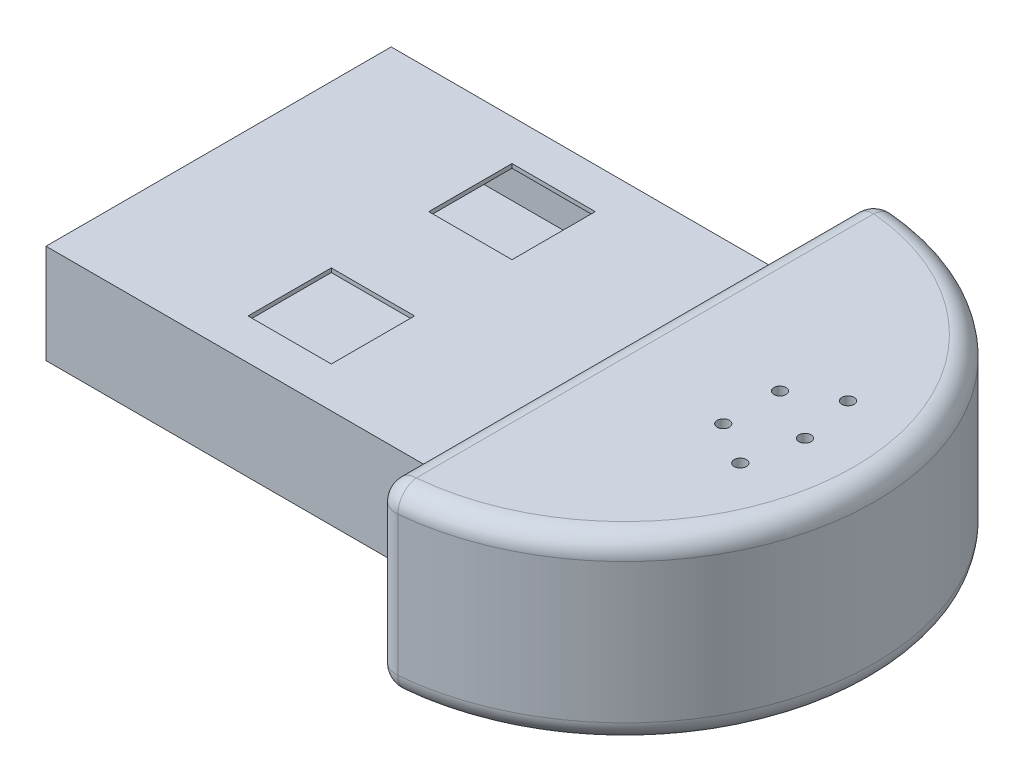
ISO-10303-21;
HEADER;
FILE_DESCRIPTION(('STEP AP214'),'2;1');
FILE_NAME('part.step','',(''),(''),'','','');
FILE_SCHEMA(('AUTOMOTIVE_DESIGN { 1 0 10303 214 1 1 1 1 }'));
ENDSEC;
DATA;
#1=APPLICATION_CONTEXT('core data for automotive mechanical design processes');
#2=APPLICATION_PROTOCOL_DEFINITION('international standard','automotive_design',2000,#1);
#3=PRODUCT_CONTEXT('',#1,'mechanical');
#4=PRODUCT('Part','Part','',(#3));
#5=PRODUCT_RELATED_PRODUCT_CATEGORY('part','',(#4));
#6=PRODUCT_DEFINITION_FORMATION('','',#4);
#7=PRODUCT_DEFINITION_CONTEXT('part definition',#1,'design');
#8=PRODUCT_DEFINITION('design','',#6,#7);
#9=PRODUCT_DEFINITION_SHAPE('','',#8);
#10=(LENGTH_UNIT() NAMED_UNIT(*) SI_UNIT(.MILLI.,.METRE.));
#11=(NAMED_UNIT(*) PLANE_ANGLE_UNIT() SI_UNIT($,.RADIAN.));
#12=(NAMED_UNIT(*) SI_UNIT($,.STERADIAN.) SOLID_ANGLE_UNIT());
#13=UNCERTAINTY_MEASURE_WITH_UNIT(LENGTH_MEASURE(1.E-05),#10,'distance_accuracy_value','');
#14=(GEOMETRIC_REPRESENTATION_CONTEXT(3) GLOBAL_UNCERTAINTY_ASSIGNED_CONTEXT((#13)) GLOBAL_UNIT_ASSIGNED_CONTEXT((#10,
#11,#12)) REPRESENTATION_CONTEXT('',''));
#15=CARTESIAN_POINT('',(0.,0.,0.));
#16=DIRECTION('',(0.,0.,1.));
#17=DIRECTION('',(1.,0.,0.));
#18=AXIS2_PLACEMENT_3D('',#15,#16,#17);
#19=CARTESIAN_POINT('',(5.,0.,0.));
#20=DIRECTION('',(0.,1.,0.));
#21=DIRECTION('',(0.,0.,1.));
#22=AXIS2_PLACEMENT_3D('',#19,#20,#21);
#23=PLANE('',#22);
#24=DIRECTION('',(0.,0.,-1.));
#25=VECTOR('',#24,1.);
#26=CARTESIAN_POINT('',(5.,0.,6.15430778684045));
#27=LINE('',#26,#25);
#28=CARTESIAN_POINT('',(5.,0.,4.25));
#29=VERTEX_POINT('',#28);
#30=CARTESIAN_POINT('',(5.,0.,-4.25));
#31=VERTEX_POINT('',#30);
#32=EDGE_CURVE('E297',#29,#31,#27,.T.);
#33=ORIENTED_EDGE('',*,*,#32,.F.);
#34=DIRECTION('',(1.,0.,0.));
#35=VECTOR('',#34,1.);
#36=CARTESIAN_POINT('',(-5.,0.,4.25));
#37=LINE('',#36,#35);
#38=CARTESIAN_POINT('',(-5.,0.,4.25));
#39=VERTEX_POINT('',#38);
#40=EDGE_CURVE('E307',#39,#29,#37,.T.);
#41=ORIENTED_EDGE('',*,*,#40,.F.);
#42=DIRECTION('',(0.,0.,1.));
#43=VECTOR('',#42,1.);
#44=CARTESIAN_POINT('',(-5.,0.,-4.25));
#45=LINE('',#44,#43);
#46=CARTESIAN_POINT('',(-5.,0.,-4.25));
#47=VERTEX_POINT('',#46);
#48=EDGE_CURVE('E313',#47,#39,#45,.T.);
#49=ORIENTED_EDGE('',*,*,#48,.F.);
#50=DIRECTION('',(-1.,0.,0.));
#51=VECTOR('',#50,1.);
#52=CARTESIAN_POINT('',(-5.,0.,-4.25));
#53=LINE('',#52,#51);
#54=EDGE_CURVE('E290',#31,#47,#53,.T.);
#55=ORIENTED_EDGE('',*,*,#54,.F.);
#56=EDGE_LOOP('',(#33,#41,#49,#55));
#57=FACE_BOUND('',#56,.T.);
#58=ADVANCED_FACE('F35',(#57),#23,.F.);
#59=CARTESIAN_POINT('',(5.,2.44,0.));
#60=DIRECTION('',(0.,-1.,0.));
#61=DIRECTION('',(0.,0.,-1.));
#62=AXIS2_PLACEMENT_3D('',#59,#60,#61);
#63=CYLINDRICAL_SURFACE('',#62,6.15430778684045);
#64=DIRECTION('',(0.,-1.,0.));
#65=VECTOR('',#64,1.);
#66=CARTESIAN_POINT('',(5.54421407702316,2.44,6.13019864062616));
#67=LINE('',#66,#65);
#68=CARTESIAN_POINT('',(5.54421407702316,2.94,6.13019864062616));
#69=VERTEX_POINT('',#68);
#70=CARTESIAN_POINT('',(5.54421407702316,-0.5,6.13019864062616));
#71=VERTEX_POINT('',#70);
#72=EDGE_CURVE('E347',#69,#71,#67,.T.);
#73=ORIENTED_EDGE('',*,*,#72,.T.);
#74=CARTESIAN_POINT('',(5.,-0.5,0.));
#75=DIRECTION('',(0.,-1.,0.));
#76=DIRECTION('',(0.,0.,-1.));
#77=AXIS2_PLACEMENT_3D('',#74,#75,#76);
#78=CIRCLE('',#77,6.15430778684045);
#79=CARTESIAN_POINT('',(5.54421407702316,-0.5,-6.13019864062616));
#80=VERTEX_POINT('',#79);
#81=EDGE_CURVE('E352',#71,#80,#78,.F.);
#82=ORIENTED_EDGE('',*,*,#81,.T.);
#83=DIRECTION('',(0.,-1.,0.));
#84=VECTOR('',#83,1.);
#85=CARTESIAN_POINT('',(5.54421407702316,2.44,-6.13019864062616));
#86=LINE('',#85,#84);
#87=CARTESIAN_POINT('',(5.54421407702316,2.94,-6.13019864062616));
#88=VERTEX_POINT('',#87);
#89=EDGE_CURVE('E349',#80,#88,#86,.F.);
#90=ORIENTED_EDGE('',*,*,#89,.T.);
#91=CARTESIAN_POINT('',(5.,2.94,0.));
#92=DIRECTION('',(0.,1.,0.));
#93=DIRECTION('',(0.,0.,1.));
#94=AXIS2_PLACEMENT_3D('',#91,#92,#93);
#95=CIRCLE('',#94,6.15430778684045);
#96=EDGE_CURVE('E345',#88,#69,#95,.F.);
#97=ORIENTED_EDGE('',*,*,#96,.T.);
#98=EDGE_LOOP('',(#73,#82,#90,#97));
#99=FACE_BOUND('',#98,.T.);
#100=ADVANCED_FACE('F420',(#99),#63,.T.);
#101=CARTESIAN_POINT('',(5.,2.44,-6.15430778684045));
#102=DIRECTION('',(1.,0.,0.));
#103=DIRECTION('',(0.,0.,-1.));
#104=AXIS2_PLACEMENT_3D('',#101,#102,#103);
#105=PLANE('',#104);
#106=DIRECTION('',(0.,0.,1.));
#107=VECTOR('',#106,1.);
#108=CARTESIAN_POINT('',(5.,2.94,-6.15430778684045));
#109=LINE('',#108,#107);
#110=CARTESIAN_POINT('',(5.,2.94,5.63215736182189));
#111=VERTEX_POINT('',#110);
#112=CARTESIAN_POINT('',(5.,2.94,-5.63215736182189));
#113=VERTEX_POINT('',#112);
#114=EDGE_CURVE('E333',#111,#113,#109,.F.);
#115=ORIENTED_EDGE('',*,*,#114,.T.);
#116=DIRECTION('',(0.,-1.,0.));
#117=VECTOR('',#116,1.);
#118=CARTESIAN_POINT('',(5.,2.44,-5.63215736182189));
#119=LINE('',#118,#117);
#120=CARTESIAN_POINT('',(5.,-0.5,-5.63215736182189));
#121=VERTEX_POINT('',#120);
#122=EDGE_CURVE('E338',#113,#121,#119,.T.);
#123=ORIENTED_EDGE('',*,*,#122,.T.);
#124=DIRECTION('',(0.,0.,-1.));
#125=VECTOR('',#124,1.);
#126=CARTESIAN_POINT('',(5.,-0.5,6.15430778684045));
#127=LINE('',#126,#125);
#128=CARTESIAN_POINT('',(5.,-0.5,5.63215736182189));
#129=VERTEX_POINT('',#128);
#130=EDGE_CURVE('E335',#121,#129,#127,.F.);
#131=ORIENTED_EDGE('',*,*,#130,.T.);
#132=DIRECTION('',(0.,-1.,0.));
#133=VECTOR('',#132,1.);
#134=CARTESIAN_POINT('',(5.,2.44,5.63215736182189));
#135=LINE('',#134,#133);
#136=EDGE_CURVE('E331',#129,#111,#135,.F.);
#137=ORIENTED_EDGE('',*,*,#136,.T.);
#138=EDGE_LOOP('',(#115,#123,#131,#137));
#139=FACE_BOUND('',#138,.T.);
#140=DIRECTION('',(0.,-1.,0.));
#141=VECTOR('',#140,1.);
#142=CARTESIAN_POINT('',(5.,2.44,4.25));
#143=LINE('',#142,#141);
#144=CARTESIAN_POINT('',(5.,2.44,4.25));
#145=VERTEX_POINT('',#144);
#146=EDGE_CURVE('E311',#145,#29,#143,.T.);
#147=ORIENTED_EDGE('',*,*,#146,.T.);
#148=ORIENTED_EDGE('',*,*,#32,.T.);
#149=DIRECTION('',(0.,-1.,0.));
#150=VECTOR('',#149,1.);
#151=CARTESIAN_POINT('',(5.,2.44,-4.25));
#152=LINE('',#151,#150);
#153=CARTESIAN_POINT('',(5.,2.44,-4.25));
#154=VERTEX_POINT('',#153);
#155=EDGE_CURVE('E303',#154,#31,#152,.T.);
#156=ORIENTED_EDGE('',*,*,#155,.F.);
#157=DIRECTION('',(0.,0.,1.));
#158=VECTOR('',#157,1.);
#159=CARTESIAN_POINT('',(5.,2.44,-6.15430778684045));
#160=LINE('',#159,#158);
#161=EDGE_CURVE('E300',#154,#145,#160,.T.);
#162=ORIENTED_EDGE('',*,*,#161,.T.);
#163=EDGE_LOOP('',(#147,#148,#156,#162));
#164=FACE_BOUND('',#163,.T.);
#165=ADVANCED_FACE('F426',(#139,#164),#105,.F.);
#166=CARTESIAN_POINT('',(-5.,2.44,-4.25));
#167=DIRECTION('',(0.,0.,1.));
#168=DIRECTION('',(1.,0.,0.));
#169=AXIS2_PLACEMENT_3D('',#166,#167,#168);
#170=PLANE('',#169);
#171=ORIENTED_EDGE('',*,*,#54,.T.);
#172=DIRECTION('',(0.,-1.,0.));
#173=VECTOR('',#172,1.);
#174=CARTESIAN_POINT('',(-5.,2.44,-4.25));
#175=LINE('',#174,#173);
#176=CARTESIAN_POINT('',(-5.,2.44,-4.25));
#177=VERTEX_POINT('',#176);
#178=EDGE_CURVE('E322',#177,#47,#175,.T.);
#179=ORIENTED_EDGE('',*,*,#178,.F.);
#180=DIRECTION('',(-1.,0.,0.));
#181=VECTOR('',#180,1.);
#182=CARTESIAN_POINT('',(-5.,2.44,-4.25));
#183=LINE('',#182,#181);
#184=EDGE_CURVE('E304',#154,#177,#183,.T.);
#185=ORIENTED_EDGE('',*,*,#184,.F.);
#186=ORIENTED_EDGE('',*,*,#155,.T.);
#187=EDGE_LOOP('',(#171,#179,#185,#186));
#188=FACE_BOUND('',#187,.T.);
#189=ADVANCED_FACE('F439',(#188),#170,.F.);
#190=CARTESIAN_POINT('',(-5.,2.44,-4.25));
#191=DIRECTION('',(1.,0.,0.));
#192=DIRECTION('',(0.,0.,-1.));
#193=AXIS2_PLACEMENT_3D('',#190,#191,#192);
#194=PLANE('',#193);
#195=DIRECTION('',(0.,0.,1.));
#196=VECTOR('',#195,1.);
#197=CARTESIAN_POINT('',(-5.,0.75,-4.15));
#198=LINE('',#197,#196);
#199=CARTESIAN_POINT('',(-5.,0.75,-4.15));
#200=VERTEX_POINT('',#199);
#201=CARTESIAN_POINT('',(-5.,0.75,4.15));
#202=VERTEX_POINT('',#201);
#203=EDGE_CURVE('E279',#200,#202,#198,.T.);
#204=ORIENTED_EDGE('',*,*,#203,.F.);
#205=DIRECTION('',(0.,-1.,0.));
#206=VECTOR('',#205,1.);
#207=CARTESIAN_POINT('',(-5.,2.34,-4.15));
#208=LINE('',#207,#206);
#209=CARTESIAN_POINT('',(-5.,2.34,-4.15));
#210=VERTEX_POINT('',#209);
#211=EDGE_CURVE('E277',#210,#200,#208,.T.);
#212=ORIENTED_EDGE('',*,*,#211,.F.);
#213=DIRECTION('',(0.,0.,-1.));
#214=VECTOR('',#213,1.);
#215=CARTESIAN_POINT('',(-5.,2.34,-4.15));
#216=LINE('',#215,#214);
#217=CARTESIAN_POINT('',(-5.,2.34,4.15));
#218=VERTEX_POINT('',#217);
#219=EDGE_CURVE('E267',#218,#210,#216,.T.);
#220=ORIENTED_EDGE('',*,*,#219,.F.);
#221=DIRECTION('',(0.,1.,0.));
#222=VECTOR('',#221,1.);
#223=CARTESIAN_POINT('',(-5.,2.34,4.15));
#224=LINE('',#223,#222);
#225=EDGE_CURVE('E283',#202,#218,#224,.T.);
#226=ORIENTED_EDGE('',*,*,#225,.F.);
#227=EDGE_LOOP('',(#204,#212,#220,#226));
#228=FACE_BOUND('',#227,.T.);
#229=ORIENTED_EDGE('',*,*,#48,.T.);
#230=DIRECTION('',(0.,-1.,0.));
#231=VECTOR('',#230,1.);
#232=CARTESIAN_POINT('',(-5.,2.44,4.25));
#233=LINE('',#232,#231);
#234=CARTESIAN_POINT('',(-5.,2.44,4.25));
#235=VERTEX_POINT('',#234);
#236=EDGE_CURVE('E319',#235,#39,#233,.T.);
#237=ORIENTED_EDGE('',*,*,#236,.F.);
#238=DIRECTION('',(0.,0.,1.));
#239=VECTOR('',#238,1.);
#240=CARTESIAN_POINT('',(-5.,2.44,-4.25));
#241=LINE('',#240,#239);
#242=EDGE_CURVE('E306',#177,#235,#241,.T.);
#243=ORIENTED_EDGE('',*,*,#242,.F.);
#244=ORIENTED_EDGE('',*,*,#178,.T.);
#245=EDGE_LOOP('',(#229,#237,#243,#244));
#246=FACE_BOUND('',#245,.T.);
#247=ADVANCED_FACE('F435',(#228,#246),#194,.F.);
#248=CARTESIAN_POINT('',(-5.,2.44,4.25));
#249=DIRECTION('',(0.,0.,-1.));
#250=DIRECTION('',(-1.,0.,0.));
#251=AXIS2_PLACEMENT_3D('',#248,#249,#250);
#252=PLANE('',#251);
#253=ORIENTED_EDGE('',*,*,#40,.T.);
#254=ORIENTED_EDGE('',*,*,#146,.F.);
#255=DIRECTION('',(1.,0.,0.));
#256=VECTOR('',#255,1.);
#257=CARTESIAN_POINT('',(-5.,2.44,4.25));
#258=LINE('',#257,#256);
#259=EDGE_CURVE('E309',#235,#145,#258,.T.);
#260=ORIENTED_EDGE('',*,*,#259,.F.);
#261=ORIENTED_EDGE('',*,*,#236,.T.);
#262=EDGE_LOOP('',(#253,#254,#260,#261));
#263=FACE_BOUND('',#262,.T.);
#264=ADVANCED_FACE('F432',(#263),#252,.F.);
#265=CARTESIAN_POINT('',(5.,2.44,0.));
#266=DIRECTION('',(0.,1.,0.));
#267=DIRECTION('',(0.,0.,1.));
#268=AXIS2_PLACEMENT_3D('',#265,#266,#267);
#269=PLANE('',#268);
#270=DIRECTION('',(0.,0.,1.));
#271=VECTOR('',#270,1.);
#272=CARTESIAN_POINT('',(-1.025,2.44,3.25));
#273=LINE('',#272,#271);
#274=CARTESIAN_POINT('',(-1.025,2.44,1.2));
#275=VERTEX_POINT('',#274);
#276=CARTESIAN_POINT('',(-1.025,2.44,3.25));
#277=VERTEX_POINT('',#276);
#278=EDGE_CURVE('E50',#275,#277,#273,.T.);
#279=ORIENTED_EDGE('',*,*,#278,.F.);
#280=DIRECTION('',(-1.,0.,0.));
#281=VECTOR('',#280,1.);
#282=CARTESIAN_POINT('',(-1.025,2.44,1.2));
#283=LINE('',#282,#281);
#284=CARTESIAN_POINT('',(1.025,2.44,1.2));
#285=VERTEX_POINT('',#284);
#286=EDGE_CURVE('E203',#285,#275,#283,.T.);
#287=ORIENTED_EDGE('',*,*,#286,.F.);
#288=DIRECTION('',(0.,0.,-1.));
#289=VECTOR('',#288,1.);
#290=CARTESIAN_POINT('',(1.025,2.44,3.25));
#291=LINE('',#290,#289);
#292=CARTESIAN_POINT('',(1.025,2.44,3.25));
#293=VERTEX_POINT('',#292);
#294=EDGE_CURVE('E187',#293,#285,#291,.T.);
#295=ORIENTED_EDGE('',*,*,#294,.F.);
#296=DIRECTION('',(1.,0.,0.));
#297=VECTOR('',#296,1.);
#298=CARTESIAN_POINT('',(-1.025,2.44,3.25));
#299=LINE('',#298,#297);
#300=EDGE_CURVE('E196',#277,#293,#299,.T.);
#301=ORIENTED_EDGE('',*,*,#300,.F.);
#302=EDGE_LOOP('',(#279,#287,#295,#301));
#303=FACE_BOUND('',#302,.T.);
#304=DIRECTION('',(0.,0.,-1.));
#305=VECTOR('',#304,1.);
#306=CARTESIAN_POINT('',(1.025,2.44,-3.25));
#307=LINE('',#306,#305);
#308=CARTESIAN_POINT('',(1.025,2.44,-1.2));
#309=VERTEX_POINT('',#308);
#310=CARTESIAN_POINT('',(1.025,2.44,-3.25));
#311=VERTEX_POINT('',#310);
#312=EDGE_CURVE('E210',#309,#311,#307,.T.);
#313=ORIENTED_EDGE('',*,*,#312,.F.);
#314=DIRECTION('',(1.,0.,0.));
#315=VECTOR('',#314,1.);
#316=CARTESIAN_POINT('',(-1.025,2.44,-1.2));
#317=LINE('',#316,#315);
#318=CARTESIAN_POINT('',(-1.025,2.44,-1.2));
#319=VERTEX_POINT('',#318);
#320=EDGE_CURVE('E220',#319,#309,#317,.T.);
#321=ORIENTED_EDGE('',*,*,#320,.F.);
#322=DIRECTION('',(0.,0.,1.));
#323=VECTOR('',#322,1.);
#324=CARTESIAN_POINT('',(-1.025,2.44,-3.25));
#325=LINE('',#324,#323);
#326=CARTESIAN_POINT('',(-1.025,2.44,-3.25));
#327=VERTEX_POINT('',#326);
#328=EDGE_CURVE('E217',#327,#319,#325,.T.);
#329=ORIENTED_EDGE('',*,*,#328,.F.);
#330=DIRECTION('',(-1.,0.,0.));
#331=VECTOR('',#330,1.);
#332=CARTESIAN_POINT('',(-1.025,2.44,-3.25));
#333=LINE('',#332,#331);
#334=EDGE_CURVE('E214',#311,#327,#333,.T.);
#335=ORIENTED_EDGE('',*,*,#334,.F.);
#336=EDGE_LOOP('',(#313,#321,#329,#335));
#337=FACE_BOUND('',#336,.T.);
#338=ORIENTED_EDGE('',*,*,#161,.F.);
#339=ORIENTED_EDGE('',*,*,#184,.T.);
#340=ORIENTED_EDGE('',*,*,#242,.T.);
#341=ORIENTED_EDGE('',*,*,#259,.T.);
#342=EDGE_LOOP('',(#338,#339,#340,#341));
#343=FACE_BOUND('',#342,.T.);
#344=ADVANCED_FACE('F200',(#303,#337,#343),#269,.T.);
#345=CARTESIAN_POINT('',(5.,3.44,0.));
#346=DIRECTION('',(0.,1.,0.));
#347=DIRECTION('',(0.,0.,1.));
#348=AXIS2_PLACEMENT_3D('',#345,#346,#347);
#349=PLANE('',#348);
#350=CARTESIAN_POINT('',(8.12550407870656,3.44,-0.698038394358999));
#351=DIRECTION('',(0.,1.,0.));
#352=DIRECTION('',(0.,0.,1.));
#353=AXIS2_PLACEMENT_3D('',#350,#351,#352);
#354=CIRCLE('',#353,0.15);
#355=CARTESIAN_POINT('',(8.12550407870656,3.44,-0.548038394358999));
#356=VERTEX_POINT('',#355);
#357=EDGE_CURVE('E237',#356,#356,#354,.T.);
#358=ORIENTED_EDGE('',*,*,#357,.F.);
#359=EDGE_LOOP('',(#358));
#360=FACE_BOUND('',#359,.T.);
#361=CARTESIAN_POINT('',(9.43965854921009,3.44,0.));
#362=DIRECTION('',(0.,1.,0.));
#363=DIRECTION('',(0.,0.,1.));
#364=AXIS2_PLACEMENT_3D('',#361,#362,#363);
#365=CIRCLE('',#364,0.15);
#366=CARTESIAN_POINT('',(9.43965854921009,3.44,0.15));
#367=VERTEX_POINT('',#366);
#368=EDGE_CURVE('E243',#367,#367,#365,.T.);
#369=ORIENTED_EDGE('',*,*,#368,.F.);
#370=EDGE_LOOP('',(#369));
#371=FACE_BOUND('',#370,.T.);
#372=CARTESIAN_POINT('',(9.17217578087752,3.44,1.32604141566157));
#373=DIRECTION('',(0.,1.,0.));
#374=DIRECTION('',(0.,0.,-1.));
#375=AXIS2_PLACEMENT_3D('',#372,#373,#374);
#376=CIRCLE('',#375,0.15);
#377=CARTESIAN_POINT('',(9.17217578087752,3.44,1.17604141566157));
#378=VERTEX_POINT('',#377);
#379=EDGE_CURVE('E249',#378,#378,#376,.T.);
#380=ORIENTED_EDGE('',*,*,#379,.F.);
#381=EDGE_LOOP('',(#380));
#382=FACE_BOUND('',#381,.T.);
#383=CARTESIAN_POINT('',(8.12550407870656,3.44,0.698038394358999));
#384=DIRECTION('',(0.,1.,0.));
#385=DIRECTION('',(0.,0.,-1.));
#386=AXIS2_PLACEMENT_3D('',#383,#384,#385);
#387=CIRCLE('',#386,0.15);
#388=CARTESIAN_POINT('',(8.12550407870656,3.44,0.548038394358999));
#389=VERTEX_POINT('',#388);
#390=EDGE_CURVE('E226',#389,#389,#387,.T.);
#391=ORIENTED_EDGE('',*,*,#390,.F.);
#392=EDGE_LOOP('',(#391));
#393=FACE_BOUND('',#392,.T.);
#394=CARTESIAN_POINT('',(9.17217578087752,3.44,-1.32604141566157));
#395=DIRECTION('',(0.,1.,0.));
#396=DIRECTION('',(0.,0.,1.));
#397=AXIS2_PLACEMENT_3D('',#394,#395,#396);
#398=CIRCLE('',#397,0.15);
#399=CARTESIAN_POINT('',(9.17217578087752,3.44,-1.17604141566157));
#400=VERTEX_POINT('',#399);
#401=EDGE_CURVE('E236',#400,#400,#398,.T.);
#402=ORIENTED_EDGE('',*,*,#401,.F.);
#403=EDGE_LOOP('',(#402));
#404=FACE_BOUND('',#403,.T.);
#405=CARTESIAN_POINT('',(5.,3.44,0.));
#406=DIRECTION('',(0.,1.,0.));
#407=DIRECTION('',(0.,0.,1.));
#408=AXIS2_PLACEMENT_3D('',#405,#406,#407);
#409=CIRCLE('',#408,5.65430778684045);
#410=CARTESIAN_POINT('',(5.5,3.44,5.63215736182189));
#411=VERTEX_POINT('',#410);
#412=CARTESIAN_POINT('',(5.5,3.44,-5.63215736182189));
#413=VERTEX_POINT('',#412);
#414=EDGE_CURVE('E340',#411,#413,#409,.T.);
#415=ORIENTED_EDGE('',*,*,#414,.T.);
#416=DIRECTION('',(0.,0.,1.));
#417=VECTOR('',#416,1.);
#418=CARTESIAN_POINT('',(5.5,3.44,6.15430778684045));
#419=LINE('',#418,#417);
#420=EDGE_CURVE('E342',#413,#411,#419,.T.);
#421=ORIENTED_EDGE('',*,*,#420,.T.);
#422=EDGE_LOOP('',(#415,#421));
#423=FACE_BOUND('',#422,.T.);
#424=ADVANCED_FACE('F497',(#360,#371,#382,#393,#404,#423),#349,.T.);
#425=CARTESIAN_POINT('',(5.,-1.,0.));
#426=DIRECTION('',(0.,-1.,0.));
#427=DIRECTION('',(0.,0.,-1.));
#428=AXIS2_PLACEMENT_3D('',#425,#426,#427);
#429=PLANE('',#428);
#430=CARTESIAN_POINT('',(5.,-1.,0.));
#431=DIRECTION('',(0.,-1.,0.));
#432=DIRECTION('',(0.,0.,-1.));
#433=AXIS2_PLACEMENT_3D('',#430,#431,#432);
#434=CIRCLE('',#433,5.65430778684045);
#435=CARTESIAN_POINT('',(5.5,-1.,-5.63215736182189));
#436=VERTEX_POINT('',#435);
#437=CARTESIAN_POINT('',(5.5,-1.,5.63215736182189));
#438=VERTEX_POINT('',#437);
#439=EDGE_CURVE('E299',#436,#438,#434,.T.);
#440=ORIENTED_EDGE('',*,*,#439,.T.);
#441=DIRECTION('',(0.,0.,-1.));
#442=VECTOR('',#441,1.);
#443=CARTESIAN_POINT('',(5.5,-1.,-6.15430778684045));
#444=LINE('',#443,#442);
#445=EDGE_CURVE('E328',#438,#436,#444,.T.);
#446=ORIENTED_EDGE('',*,*,#445,.T.);
#447=EDGE_LOOP('',(#440,#446));
#448=FACE_BOUND('',#447,.T.);
#449=ADVANCED_FACE('F499',(#448),#429,.T.);
#450=CARTESIAN_POINT('',(5.,2.34,-4.15));
#451=DIRECTION('',(0.,0.,-1.));
#452=DIRECTION('',(-1.,0.,0.));
#453=AXIS2_PLACEMENT_3D('',#450,#451,#452);
#454=PLANE('',#453);
#455=ORIENTED_EDGE('',*,*,#211,.T.);
#456=DIRECTION('',(-1.,0.,0.));
#457=VECTOR('',#456,1.);
#458=CARTESIAN_POINT('',(5.,0.75,-4.15));
#459=LINE('',#458,#457);
#460=CARTESIAN_POINT('',(5.,0.75,-4.15));
#461=VERTEX_POINT('',#460);
#462=EDGE_CURVE('E276',#461,#200,#459,.T.);
#463=ORIENTED_EDGE('',*,*,#462,.F.);
#464=DIRECTION('',(0.,-1.,0.));
#465=VECTOR('',#464,1.);
#466=CARTESIAN_POINT('',(5.,2.34,-4.15));
#467=LINE('',#466,#465);
#468=CARTESIAN_POINT('',(5.,2.34,-4.15));
#469=VERTEX_POINT('',#468);
#470=EDGE_CURVE('E263',#469,#461,#467,.T.);
#471=ORIENTED_EDGE('',*,*,#470,.F.);
#472=DIRECTION('',(-1.,0.,0.));
#473=VECTOR('',#472,1.);
#474=CARTESIAN_POINT('',(5.,2.34,-4.15));
#475=LINE('',#474,#473);
#476=EDGE_CURVE('E288',#469,#210,#475,.T.);
#477=ORIENTED_EDGE('',*,*,#476,.T.);
#478=EDGE_LOOP('',(#455,#463,#471,#477));
#479=FACE_BOUND('',#478,.T.);
#480=ADVANCED_FACE('F505',(#479),#454,.F.);
#481=CARTESIAN_POINT('',(5.,2.34,-4.15));
#482=DIRECTION('',(0.,1.,0.));
#483=DIRECTION('',(0.,0.,1.));
#484=AXIS2_PLACEMENT_3D('',#481,#482,#483);
#485=PLANE('',#484);
#486=DIRECTION('',(-1.,0.,0.));
#487=VECTOR('',#486,1.);
#488=CARTESIAN_POINT('',(5.,2.34,1.2));
#489=LINE('',#488,#487);
#490=CARTESIAN_POINT('',(1.025,2.34,1.2));
#491=VERTEX_POINT('',#490);
#492=CARTESIAN_POINT('',(-1.025,2.34,1.2));
#493=VERTEX_POINT('',#492);
#494=EDGE_CURVE('E43',#491,#493,#489,.T.);
#495=ORIENTED_EDGE('',*,*,#494,.T.);
#496=DIRECTION('',(0.,0.,1.));
#497=VECTOR('',#496,1.);
#498=CARTESIAN_POINT('',(-1.025,2.34,-4.15));
#499=LINE('',#498,#497);
#500=CARTESIAN_POINT('',(-1.025,2.34,3.25));
#501=VERTEX_POINT('',#500);
#502=EDGE_CURVE('E11',#493,#501,#499,.T.);
#503=ORIENTED_EDGE('',*,*,#502,.T.);
#504=DIRECTION('',(1.,0.,0.));
#505=VECTOR('',#504,1.);
#506=CARTESIAN_POINT('',(5.,2.34,3.25));
#507=LINE('',#506,#505);
#508=CARTESIAN_POINT('',(1.025,2.34,3.25));
#509=VERTEX_POINT('',#508);
#510=EDGE_CURVE('E396',#501,#509,#507,.T.);
#511=ORIENTED_EDGE('',*,*,#510,.T.);
#512=DIRECTION('',(0.,0.,-1.));
#513=VECTOR('',#512,1.);
#514=CARTESIAN_POINT('',(1.025,2.34,-4.15));
#515=LINE('',#514,#513);
#516=EDGE_CURVE('E190',#509,#491,#515,.T.);
#517=ORIENTED_EDGE('',*,*,#516,.T.);
#518=EDGE_LOOP('',(#495,#503,#511,#517));
#519=FACE_BOUND('',#518,.T.);
#520=DIRECTION('',(1.,0.,0.));
#521=VECTOR('',#520,1.);
#522=CARTESIAN_POINT('',(5.,2.34,-1.2));
#523=LINE('',#522,#521);
#524=CARTESIAN_POINT('',(-1.025,2.34,-1.2));
#525=VERTEX_POINT('',#524);
#526=CARTESIAN_POINT('',(1.025,2.34,-1.2));
#527=VERTEX_POINT('',#526);
#528=EDGE_CURVE('E390',#525,#527,#523,.T.);
#529=ORIENTED_EDGE('',*,*,#528,.T.);
#530=DIRECTION('',(0.,0.,-1.));
#531=VECTOR('',#530,1.);
#532=CARTESIAN_POINT('',(1.025,2.34,-4.15));
#533=LINE('',#532,#531);
#534=CARTESIAN_POINT('',(1.025,2.34,-3.25));
#535=VERTEX_POINT('',#534);
#536=EDGE_CURVE('E393',#527,#535,#533,.T.);
#537=ORIENTED_EDGE('',*,*,#536,.T.);
#538=DIRECTION('',(-1.,0.,0.));
#539=VECTOR('',#538,1.);
#540=CARTESIAN_POINT('',(5.,2.34,-3.25));
#541=LINE('',#540,#539);
#542=CARTESIAN_POINT('',(-1.025,2.34,-3.25));
#543=VERTEX_POINT('',#542);
#544=EDGE_CURVE('E354',#535,#543,#541,.T.);
#545=ORIENTED_EDGE('',*,*,#544,.T.);
#546=DIRECTION('',(0.,0.,1.));
#547=VECTOR('',#546,1.);
#548=CARTESIAN_POINT('',(-1.025,2.34,-4.15));
#549=LINE('',#548,#547);
#550=EDGE_CURVE('E387',#543,#525,#549,.T.);
#551=ORIENTED_EDGE('',*,*,#550,.T.);
#552=EDGE_LOOP('',(#529,#537,#545,#551));
#553=FACE_BOUND('',#552,.T.);
#554=ORIENTED_EDGE('',*,*,#219,.T.);
#555=ORIENTED_EDGE('',*,*,#476,.F.);
#556=DIRECTION('',(0.,0.,-1.));
#557=VECTOR('',#556,1.);
#558=CARTESIAN_POINT('',(5.,2.34,-4.15));
#559=LINE('',#558,#557);
#560=CARTESIAN_POINT('',(5.,2.34,4.15));
#561=VERTEX_POINT('',#560);
#562=EDGE_CURVE('E273',#561,#469,#559,.T.);
#563=ORIENTED_EDGE('',*,*,#562,.F.);
#564=DIRECTION('',(-1.,0.,0.));
#565=VECTOR('',#564,1.);
#566=CARTESIAN_POINT('',(5.,2.34,4.15));
#567=LINE('',#566,#565);
#568=EDGE_CURVE('E291',#561,#218,#567,.T.);
#569=ORIENTED_EDGE('',*,*,#568,.T.);
#570=EDGE_LOOP('',(#554,#555,#563,#569));
#571=FACE_BOUND('',#570,.T.);
#572=ADVANCED_FACE('F400',(#519,#553,#571),#485,.F.);
#573=CARTESIAN_POINT('',(5.,2.34,4.15));
#574=DIRECTION('',(0.,0.,1.));
#575=DIRECTION('',(0.,-1.,0.));
#576=AXIS2_PLACEMENT_3D('',#573,#574,#575);
#577=PLANE('',#576);
#578=ORIENTED_EDGE('',*,*,#225,.T.);
#579=ORIENTED_EDGE('',*,*,#568,.F.);
#580=DIRECTION('',(0.,1.,0.));
#581=VECTOR('',#580,1.);
#582=CARTESIAN_POINT('',(5.,2.34,4.15));
#583=LINE('',#582,#581);
#584=CARTESIAN_POINT('',(5.,0.75,4.15));
#585=VERTEX_POINT('',#584);
#586=EDGE_CURVE('E270',#585,#561,#583,.T.);
#587=ORIENTED_EDGE('',*,*,#586,.F.);
#588=DIRECTION('',(-1.,0.,0.));
#589=VECTOR('',#588,1.);
#590=CARTESIAN_POINT('',(5.,0.75,4.15));
#591=LINE('',#590,#589);
#592=EDGE_CURVE('E293',#585,#202,#591,.T.);
#593=ORIENTED_EDGE('',*,*,#592,.T.);
#594=EDGE_LOOP('',(#578,#579,#587,#593));
#595=FACE_BOUND('',#594,.T.);
#596=ADVANCED_FACE('F517',(#595),#577,.F.);
#597=CARTESIAN_POINT('',(5.,0.75,-4.15));
#598=DIRECTION('',(0.,-1.,0.));
#599=DIRECTION('',(0.,0.,-1.));
#600=AXIS2_PLACEMENT_3D('',#597,#598,#599);
#601=PLANE('',#600);
#602=ORIENTED_EDGE('',*,*,#203,.T.);
#603=ORIENTED_EDGE('',*,*,#592,.F.);
#604=DIRECTION('',(0.,0.,1.));
#605=VECTOR('',#604,1.);
#606=CARTESIAN_POINT('',(5.,0.75,-4.15));
#607=LINE('',#606,#605);
#608=EDGE_CURVE('E266',#461,#585,#607,.T.);
#609=ORIENTED_EDGE('',*,*,#608,.F.);
#610=ORIENTED_EDGE('',*,*,#462,.T.);
#611=EDGE_LOOP('',(#602,#603,#609,#610));
#612=FACE_BOUND('',#611,.T.);
#613=ADVANCED_FACE('F514',(#612),#601,.F.);
#614=CARTESIAN_POINT('',(5.,0.,0.));
#615=DIRECTION('',(-1.,0.,0.));
#616=DIRECTION('',(0.,0.,1.));
#617=AXIS2_PLACEMENT_3D('',#614,#615,#616);
#618=PLANE('',#617);
#619=ORIENTED_EDGE('',*,*,#470,.T.);
#620=ORIENTED_EDGE('',*,*,#608,.T.);
#621=ORIENTED_EDGE('',*,*,#586,.T.);
#622=ORIENTED_EDGE('',*,*,#562,.T.);
#623=EDGE_LOOP('',(#619,#620,#621,#622));
#624=FACE_BOUND('',#623,.T.);
#625=ADVANCED_FACE('F485',(#624),#618,.T.);
#626=CARTESIAN_POINT('',(5.,2.94,0.));
#627=DIRECTION('',(0.,1.,0.));
#628=DIRECTION('',(0.,0.,1.));
#629=AXIS2_PLACEMENT_3D('',#626,#627,#628);
#630=TOROIDAL_SURFACE('',#629,5.65430778684045,0.5);
#631=CARTESIAN_POINT('',(5.5,2.94,-5.63215736182189));
#632=DIRECTION('',(-0.996082557608535,0.,-0.0884281540463136));
#633=DIRECTION('',(-0.0884281540463136,0.,0.996082557608536));
#634=AXIS2_PLACEMENT_3D('',#631,#632,#633);
#635=CIRCLE('',#634,0.5);
#636=EDGE_CURVE('E378',#413,#88,#635,.T.);
#637=ORIENTED_EDGE('',*,*,#636,.F.);
#638=ORIENTED_EDGE('',*,*,#414,.F.);
#639=CARTESIAN_POINT('',(5.5,2.94,5.63215736182189));
#640=DIRECTION('',(-0.996082557608535,0.,0.0884281540463136));
#641=DIRECTION('',(0.0884281540463136,0.,0.996082557608536));
#642=AXIS2_PLACEMENT_3D('',#639,#640,#641);
#643=CIRCLE('',#642,0.5);
#644=EDGE_CURVE('E381',#69,#411,#643,.T.);
#645=ORIENTED_EDGE('',*,*,#644,.F.);
#646=ORIENTED_EDGE('',*,*,#96,.F.);
#647=EDGE_LOOP('',(#637,#638,#645,#646));
#648=FACE_BOUND('',#647,.T.);
#649=ADVANCED_FACE('F37',(#648),#630,.T.);
#650=CARTESIAN_POINT('',(5.5,2.94,0.));
#651=DIRECTION('',(0.,0.,-1.));
#652=DIRECTION('',(-1.,0.,0.));
#653=AXIS2_PLACEMENT_3D('',#650,#651,#652);
#654=CYLINDRICAL_SURFACE('',#653,0.5);
#655=CARTESIAN_POINT('',(5.5,2.94,5.63215736182189));
#656=DIRECTION('',(0.,0.,1.));
#657=DIRECTION('',(1.,0.,0.));
#658=AXIS2_PLACEMENT_3D('',#655,#656,#657);
#659=CIRCLE('',#658,0.5);
#660=EDGE_CURVE('E280',#411,#111,#659,.T.);
#661=ORIENTED_EDGE('',*,*,#660,.F.);
#662=ORIENTED_EDGE('',*,*,#420,.F.);
#663=CARTESIAN_POINT('',(5.5,2.94,-5.63215736182189));
#664=DIRECTION('',(0.,0.,-1.));
#665=DIRECTION('',(0.,1.,0.));
#666=AXIS2_PLACEMENT_3D('',#663,#664,#665);
#667=CIRCLE('',#666,0.5);
#668=EDGE_CURVE('E375',#113,#413,#667,.T.);
#669=ORIENTED_EDGE('',*,*,#668,.F.);
#670=ORIENTED_EDGE('',*,*,#114,.F.);
#671=EDGE_LOOP('',(#661,#662,#669,#670));
#672=FACE_BOUND('',#671,.T.);
#673=ADVANCED_FACE('F478',(#672),#654,.T.);
#674=CARTESIAN_POINT('',(5.5,2.94,5.63215736182189));
#675=DIRECTION('',(0.,0.,1.));
#676=DIRECTION('',(1.,0.,0.));
#677=AXIS2_PLACEMENT_3D('',#674,#675,#676);
#678=SPHERICAL_SURFACE('',#677,0.5);
#679=ORIENTED_EDGE('',*,*,#644,.T.);
#680=ORIENTED_EDGE('',*,*,#660,.T.);
#681=CARTESIAN_POINT('',(5.5,2.94,5.63215736182189));
#682=DIRECTION('',(0.,1.,0.));
#683=DIRECTION('',(0.,0.,1.));
#684=AXIS2_PLACEMENT_3D('',#681,#682,#683);
#685=CIRCLE('',#684,0.5);
#686=EDGE_CURVE('E372',#69,#111,#685,.F.);
#687=ORIENTED_EDGE('',*,*,#686,.F.);
#688=EDGE_LOOP('',(#679,#680,#687));
#689=FACE_BOUND('',#688,.T.);
#690=ADVANCED_FACE('F475',(#689),#678,.T.);
#691=CARTESIAN_POINT('',(5.5,2.94,-5.63215736182189));
#692=DIRECTION('',(0.,0.,1.));
#693=DIRECTION('',(1.,0.,0.));
#694=AXIS2_PLACEMENT_3D('',#691,#692,#693);
#695=SPHERICAL_SURFACE('',#694,0.5);
#696=ORIENTED_EDGE('',*,*,#668,.T.);
#697=ORIENTED_EDGE('',*,*,#636,.T.);
#698=CARTESIAN_POINT('',(5.5,2.94,-5.63215736182189));
#699=DIRECTION('',(0.,1.,0.));
#700=DIRECTION('',(0.,0.,1.));
#701=AXIS2_PLACEMENT_3D('',#698,#699,#700);
#702=CIRCLE('',#701,0.5);
#703=EDGE_CURVE('E370',#113,#88,#702,.F.);
#704=ORIENTED_EDGE('',*,*,#703,.F.);
#705=EDGE_LOOP('',(#696,#697,#704));
#706=FACE_BOUND('',#705,.T.);
#707=ADVANCED_FACE('F471',(#706),#695,.T.);
#708=CARTESIAN_POINT('',(5.5,2.44,5.63215736182189));
#709=DIRECTION('',(0.,-1.,0.));
#710=DIRECTION('',(0.,0.,-1.));
#711=AXIS2_PLACEMENT_3D('',#708,#709,#710);
#712=CYLINDRICAL_SURFACE('',#711,0.5);
#713=ORIENTED_EDGE('',*,*,#686,.T.);
#714=ORIENTED_EDGE('',*,*,#136,.F.);
#715=CARTESIAN_POINT('',(5.5,-0.5,5.63215736182189));
#716=DIRECTION('',(0.,-1.,0.));
#717=DIRECTION('',(0.,0.,-1.));
#718=AXIS2_PLACEMENT_3D('',#715,#716,#717);
#719=CIRCLE('',#718,0.5);
#720=EDGE_CURVE('E367',#71,#129,#719,.T.);
#721=ORIENTED_EDGE('',*,*,#720,.F.);
#722=ORIENTED_EDGE('',*,*,#72,.F.);
#723=EDGE_LOOP('',(#713,#714,#721,#722));
#724=FACE_BOUND('',#723,.T.);
#725=ADVANCED_FACE('F467',(#724),#712,.T.);
#726=CARTESIAN_POINT('',(5.,-0.5,0.));
#727=DIRECTION('',(0.,-1.,0.));
#728=DIRECTION('',(0.,0.,-1.));
#729=AXIS2_PLACEMENT_3D('',#726,#727,#728);
#730=TOROIDAL_SURFACE('',#729,5.65430778684045,0.5);
#731=CARTESIAN_POINT('',(5.5,-0.5,-5.63215736182189));
#732=DIRECTION('',(-0.996082557608535,0.,-0.0884281540463136));
#733=DIRECTION('',(-0.0884281540463136,0.,0.996082557608536));
#734=AXIS2_PLACEMENT_3D('',#731,#732,#733);
#735=CIRCLE('',#734,0.5);
#736=EDGE_CURVE('E361',#80,#436,#735,.T.);
#737=ORIENTED_EDGE('',*,*,#736,.F.);
#738=ORIENTED_EDGE('',*,*,#81,.F.);
#739=CARTESIAN_POINT('',(5.5,-0.5,5.63215736182189));
#740=DIRECTION('',(-0.996082557608535,0.,0.0884281540463136));
#741=DIRECTION('',(0.0884281540463136,0.,0.996082557608536));
#742=AXIS2_PLACEMENT_3D('',#739,#740,#741);
#743=CIRCLE('',#742,0.5);
#744=EDGE_CURVE('E364',#438,#71,#743,.T.);
#745=ORIENTED_EDGE('',*,*,#744,.F.);
#746=ORIENTED_EDGE('',*,*,#439,.F.);
#747=EDGE_LOOP('',(#737,#738,#745,#746));
#748=FACE_BOUND('',#747,.T.);
#749=ADVANCED_FACE('F463',(#748),#730,.T.);
#750=CARTESIAN_POINT('',(5.5,2.44,-5.63215736182189));
#751=DIRECTION('',(0.,-1.,0.));
#752=DIRECTION('',(0.,0.,-1.));
#753=AXIS2_PLACEMENT_3D('',#750,#751,#752);
#754=CYLINDRICAL_SURFACE('',#753,0.5);
#755=ORIENTED_EDGE('',*,*,#703,.T.);
#756=ORIENTED_EDGE('',*,*,#89,.F.);
#757=CARTESIAN_POINT('',(5.5,-0.5,-5.63215736182189));
#758=DIRECTION('',(0.,-1.,0.));
#759=DIRECTION('',(0.,0.,-1.));
#760=AXIS2_PLACEMENT_3D('',#757,#758,#759);
#761=CIRCLE('',#760,0.5);
#762=EDGE_CURVE('E358',#121,#80,#761,.T.);
#763=ORIENTED_EDGE('',*,*,#762,.F.);
#764=ORIENTED_EDGE('',*,*,#122,.F.);
#765=EDGE_LOOP('',(#755,#756,#763,#764));
#766=FACE_BOUND('',#765,.T.);
#767=ADVANCED_FACE('F459',(#766),#754,.T.);
#768=CARTESIAN_POINT('',(5.5,-0.5,5.63215736182189));
#769=DIRECTION('',(0.,0.,1.));
#770=DIRECTION('',(1.,0.,0.));
#771=AXIS2_PLACEMENT_3D('',#768,#769,#770);
#772=SPHERICAL_SURFACE('',#771,0.5);
#773=ORIENTED_EDGE('',*,*,#744,.T.);
#774=ORIENTED_EDGE('',*,*,#720,.T.);
#775=CARTESIAN_POINT('',(5.5,-0.5,5.63215736182189));
#776=DIRECTION('',(0.,0.,1.));
#777=DIRECTION('',(0.,-1.,0.));
#778=AXIS2_PLACEMENT_3D('',#775,#776,#777);
#779=CIRCLE('',#778,0.5);
#780=EDGE_CURVE('E356',#438,#129,#779,.F.);
#781=ORIENTED_EDGE('',*,*,#780,.F.);
#782=EDGE_LOOP('',(#773,#774,#781));
#783=FACE_BOUND('',#782,.T.);
#784=ADVANCED_FACE('F455',(#783),#772,.T.);
#785=CARTESIAN_POINT('',(5.5,-0.5,-5.63215736182189));
#786=DIRECTION('',(0.,0.,1.));
#787=DIRECTION('',(1.,0.,0.));
#788=AXIS2_PLACEMENT_3D('',#785,#786,#787);
#789=SPHERICAL_SURFACE('',#788,0.5);
#790=ORIENTED_EDGE('',*,*,#762,.T.);
#791=ORIENTED_EDGE('',*,*,#736,.T.);
#792=CARTESIAN_POINT('',(5.5,-0.5,-5.63215736182189));
#793=DIRECTION('',(0.,0.,-1.));
#794=DIRECTION('',(-1.,0.,0.));
#795=AXIS2_PLACEMENT_3D('',#792,#793,#794);
#796=CIRCLE('',#795,0.5);
#797=EDGE_CURVE('E260',#121,#436,#796,.F.);
#798=ORIENTED_EDGE('',*,*,#797,.F.);
#799=EDGE_LOOP('',(#790,#791,#798));
#800=FACE_BOUND('',#799,.T.);
#801=ADVANCED_FACE('F451',(#800),#789,.T.);
#802=CARTESIAN_POINT('',(5.5,-0.5,0.));
#803=DIRECTION('',(0.,0.,1.));
#804=DIRECTION('',(1.,0.,0.));
#805=AXIS2_PLACEMENT_3D('',#802,#803,#804);
#806=CYLINDRICAL_SURFACE('',#805,0.5);
#807=ORIENTED_EDGE('',*,*,#780,.T.);
#808=ORIENTED_EDGE('',*,*,#130,.F.);
#809=ORIENTED_EDGE('',*,*,#797,.T.);
#810=ORIENTED_EDGE('',*,*,#445,.F.);
#811=EDGE_LOOP('',(#807,#808,#809,#810));
#812=FACE_BOUND('',#811,.T.);
#813=ADVANCED_FACE('F447',(#812),#806,.T.);
#814=CARTESIAN_POINT('',(9.17217578087752,2.94,-1.32604141566157));
#815=DIRECTION('',(0.,1.,0.));
#816=DIRECTION('',(0.,0.,1.));
#817=AXIS2_PLACEMENT_3D('',#814,#815,#816);
#818=CYLINDRICAL_SURFACE('',#817,0.15);
#819=CARTESIAN_POINT('',(9.17217578087752,2.94,-1.32604141566157));
#820=DIRECTION('',(0.,1.,0.));
#821=DIRECTION('',(0.,0.,1.));
#822=AXIS2_PLACEMENT_3D('',#819,#820,#821);
#823=CIRCLE('',#822,0.15);
#824=CARTESIAN_POINT('',(9.17217578087752,2.94,-1.17604141566157));
#825=VERTEX_POINT('',#824);
#826=EDGE_CURVE('E257',#825,#825,#823,.T.);
#827=ORIENTED_EDGE('',*,*,#826,.F.);
#828=EDGE_LOOP('',(#827));
#829=FACE_BOUND('',#828,.T.);
#830=ORIENTED_EDGE('',*,*,#401,.T.);
#831=EDGE_LOOP('',(#830));
#832=FACE_BOUND('',#831,.T.);
#833=ADVANCED_FACE('F450',(#829,#832),#818,.F.);
#834=CARTESIAN_POINT('',(9.17217578087752,2.94,-1.32604141566157));
#835=DIRECTION('',(0.,1.,0.));
#836=DIRECTION('',(0.,0.,1.));
#837=AXIS2_PLACEMENT_3D('',#834,#835,#836);
#838=PLANE('',#837);
#839=ORIENTED_EDGE('',*,*,#826,.T.);
#840=EDGE_LOOP('',(#839));
#841=FACE_BOUND('',#840,.T.);
#842=ADVANCED_FACE('F529',(#841),#838,.T.);
#843=CARTESIAN_POINT('',(8.12550407870656,2.94,0.698038394358999));
#844=DIRECTION('',(0.,1.,0.));
#845=DIRECTION('',(0.,0.,1.));
#846=AXIS2_PLACEMENT_3D('',#843,#844,#845);
#847=CYLINDRICAL_SURFACE('',#846,0.15);
#848=CARTESIAN_POINT('',(8.12550407870656,2.94,0.698038394358999));
#849=DIRECTION('',(0.,1.,0.));
#850=DIRECTION('',(0.,0.,-1.));
#851=AXIS2_PLACEMENT_3D('',#848,#849,#850);
#852=CIRCLE('',#851,0.15);
#853=CARTESIAN_POINT('',(8.12550407870656,2.94,0.548038394358999));
#854=VERTEX_POINT('',#853);
#855=EDGE_CURVE('E252',#854,#854,#852,.T.);
#856=ORIENTED_EDGE('',*,*,#855,.F.);
#857=EDGE_LOOP('',(#856));
#858=FACE_BOUND('',#857,.T.);
#859=ORIENTED_EDGE('',*,*,#390,.T.);
#860=EDGE_LOOP('',(#859));
#861=FACE_BOUND('',#860,.T.);
#862=ADVANCED_FACE('F533',(#858,#861),#847,.F.);
#863=CARTESIAN_POINT('',(8.12550407870656,2.94,0.698038394358999));
#864=DIRECTION('',(0.,-1.,0.));
#865=DIRECTION('',(0.,0.,-1.));
#866=AXIS2_PLACEMENT_3D('',#863,#864,#865);
#867=PLANE('',#866);
#868=ORIENTED_EDGE('',*,*,#855,.T.);
#869=EDGE_LOOP('',(#868));
#870=FACE_BOUND('',#869,.T.);
#871=ADVANCED_FACE('F537',(#870),#867,.F.);
#872=CARTESIAN_POINT('',(9.17217578087752,2.94,1.32604141566157));
#873=DIRECTION('',(0.,1.,0.));
#874=DIRECTION('',(0.,0.,1.));
#875=AXIS2_PLACEMENT_3D('',#872,#873,#874);
#876=CYLINDRICAL_SURFACE('',#875,0.15);
#877=CARTESIAN_POINT('',(9.17217578087752,2.94,1.32604141566157));
#878=DIRECTION('',(0.,1.,0.));
#879=DIRECTION('',(0.,0.,-1.));
#880=AXIS2_PLACEMENT_3D('',#877,#878,#879);
#881=CIRCLE('',#880,0.15);
#882=CARTESIAN_POINT('',(9.17217578087752,2.94,1.17604141566157));
#883=VERTEX_POINT('',#882);
#884=EDGE_CURVE('E246',#883,#883,#881,.T.);
#885=ORIENTED_EDGE('',*,*,#884,.F.);
#886=EDGE_LOOP('',(#885));
#887=FACE_BOUND('',#886,.T.);
#888=ORIENTED_EDGE('',*,*,#379,.T.);
#889=EDGE_LOOP('',(#888));
#890=FACE_BOUND('',#889,.T.);
#891=ADVANCED_FACE('F541',(#887,#890),#876,.F.);
#892=CARTESIAN_POINT('',(9.17217578087752,2.94,1.32604141566157));
#893=DIRECTION('',(0.,-1.,0.));
#894=DIRECTION('',(0.,0.,-1.));
#895=AXIS2_PLACEMENT_3D('',#892,#893,#894);
#896=PLANE('',#895);
#897=ORIENTED_EDGE('',*,*,#884,.T.);
#898=EDGE_LOOP('',(#897));
#899=FACE_BOUND('',#898,.T.);
#900=ADVANCED_FACE('F545',(#899),#896,.F.);
#901=CARTESIAN_POINT('',(9.43965854921009,2.94,0.));
#902=DIRECTION('',(0.,1.,0.));
#903=DIRECTION('',(0.,0.,1.));
#904=AXIS2_PLACEMENT_3D('',#901,#902,#903);
#905=CYLINDRICAL_SURFACE('',#904,0.15);
#906=CARTESIAN_POINT('',(9.43965854921009,2.94,0.));
#907=DIRECTION('',(0.,1.,0.));
#908=DIRECTION('',(0.,0.,1.));
#909=AXIS2_PLACEMENT_3D('',#906,#907,#908);
#910=CIRCLE('',#909,0.15);
#911=CARTESIAN_POINT('',(9.43965854921009,2.94,0.15));
#912=VERTEX_POINT('',#911);
#913=EDGE_CURVE('E240',#912,#912,#910,.T.);
#914=ORIENTED_EDGE('',*,*,#913,.F.);
#915=EDGE_LOOP('',(#914));
#916=FACE_BOUND('',#915,.T.);
#917=ORIENTED_EDGE('',*,*,#368,.T.);
#918=EDGE_LOOP('',(#917));
#919=FACE_BOUND('',#918,.T.);
#920=ADVANCED_FACE('F549',(#916,#919),#905,.F.);
#921=CARTESIAN_POINT('',(9.43965854921009,2.94,0.));
#922=DIRECTION('',(0.,1.,0.));
#923=DIRECTION('',(0.,0.,1.));
#924=AXIS2_PLACEMENT_3D('',#921,#922,#923);
#925=PLANE('',#924);
#926=ORIENTED_EDGE('',*,*,#913,.T.);
#927=EDGE_LOOP('',(#926));
#928=FACE_BOUND('',#927,.T.);
#929=ADVANCED_FACE('F553',(#928),#925,.T.);
#930=CARTESIAN_POINT('',(8.12550407870656,2.94,-0.698038394358999));
#931=DIRECTION('',(0.,1.,0.));
#932=DIRECTION('',(0.,0.,1.));
#933=AXIS2_PLACEMENT_3D('',#930,#931,#932);
#934=CYLINDRICAL_SURFACE('',#933,0.15);
#935=CARTESIAN_POINT('',(8.12550407870656,2.94,-0.698038394358999));
#936=DIRECTION('',(0.,1.,0.));
#937=DIRECTION('',(0.,0.,1.));
#938=AXIS2_PLACEMENT_3D('',#935,#936,#937);
#939=CIRCLE('',#938,0.15);
#940=CARTESIAN_POINT('',(8.12550407870656,2.94,-0.548038394358999));
#941=VERTEX_POINT('',#940);
#942=EDGE_CURVE('E233',#941,#941,#939,.T.);
#943=ORIENTED_EDGE('',*,*,#942,.F.);
#944=EDGE_LOOP('',(#943));
#945=FACE_BOUND('',#944,.T.);
#946=ORIENTED_EDGE('',*,*,#357,.T.);
#947=EDGE_LOOP('',(#946));
#948=FACE_BOUND('',#947,.T.);
#949=ADVANCED_FACE('F557',(#945,#948),#934,.F.);
#950=CARTESIAN_POINT('',(8.12550407870656,2.94,-0.698038394358999));
#951=DIRECTION('',(0.,1.,0.));
#952=DIRECTION('',(0.,0.,1.));
#953=AXIS2_PLACEMENT_3D('',#950,#951,#952);
#954=PLANE('',#953);
#955=ORIENTED_EDGE('',*,*,#942,.T.);
#956=EDGE_LOOP('',(#955));
#957=FACE_BOUND('',#956,.T.);
#958=ADVANCED_FACE('F561',(#957),#954,.T.);
#959=CARTESIAN_POINT('',(1.025,1.94,-3.25));
#960=DIRECTION('',(1.,0.,0.));
#961=DIRECTION('',(0.,0.,-1.));
#962=AXIS2_PLACEMENT_3D('',#959,#960,#961);
#963=PLANE('',#962);
#964=DIRECTION('',(0.,1.,0.));
#965=VECTOR('',#964,1.);
#966=CARTESIAN_POINT('',(1.025,1.94,-1.2));
#967=LINE('',#966,#965);
#968=EDGE_CURVE('E224',#527,#309,#967,.T.);
#969=ORIENTED_EDGE('',*,*,#968,.T.);
#970=ORIENTED_EDGE('',*,*,#312,.T.);
#971=DIRECTION('',(0.,1.,0.));
#972=VECTOR('',#971,1.);
#973=CARTESIAN_POINT('',(1.025,1.94,-3.25));
#974=LINE('',#973,#972);
#975=EDGE_CURVE('E223',#535,#311,#974,.T.);
#976=ORIENTED_EDGE('',*,*,#975,.F.);
#977=ORIENTED_EDGE('',*,*,#536,.F.);
#978=EDGE_LOOP('',(#969,#970,#976,#977));
#979=FACE_BOUND('',#978,.T.);
#980=ADVANCED_FACE('F565',(#979),#963,.F.);
#981=CARTESIAN_POINT('',(-1.025,1.94,-1.2));
#982=DIRECTION('',(0.,0.,1.));
#983=DIRECTION('',(1.,0.,0.));
#984=AXIS2_PLACEMENT_3D('',#981,#982,#983);
#985=PLANE('',#984);
#986=DIRECTION('',(0.,1.,0.));
#987=VECTOR('',#986,1.);
#988=CARTESIAN_POINT('',(-1.025,1.94,-1.2));
#989=LINE('',#988,#987);
#990=EDGE_CURVE('E227',#525,#319,#989,.T.);
#991=ORIENTED_EDGE('',*,*,#990,.T.);
#992=ORIENTED_EDGE('',*,*,#320,.T.);
#993=ORIENTED_EDGE('',*,*,#968,.F.);
#994=ORIENTED_EDGE('',*,*,#528,.F.);
#995=EDGE_LOOP('',(#991,#992,#993,#994));
#996=FACE_BOUND('',#995,.T.);
#997=ADVANCED_FACE('F568',(#996),#985,.F.);
#998=CARTESIAN_POINT('',(-1.025,1.94,-3.25));
#999=DIRECTION('',(-1.,0.,0.));
#1000=DIRECTION('',(0.,0.,1.));
#1001=AXIS2_PLACEMENT_3D('',#998,#999,#1000);
#1002=PLANE('',#1001);
#1003=DIRECTION('',(0.,1.,0.));
#1004=VECTOR('',#1003,1.);
#1005=CARTESIAN_POINT('',(-1.025,1.94,-3.25));
#1006=LINE('',#1005,#1004);
#1007=EDGE_CURVE('E229',#543,#327,#1006,.T.);
#1008=ORIENTED_EDGE('',*,*,#1007,.T.);
#1009=ORIENTED_EDGE('',*,*,#328,.T.);
#1010=ORIENTED_EDGE('',*,*,#990,.F.);
#1011=ORIENTED_EDGE('',*,*,#550,.F.);
#1012=EDGE_LOOP('',(#1008,#1009,#1010,#1011));
#1013=FACE_BOUND('',#1012,.T.);
#1014=ADVANCED_FACE('F414',(#1013),#1002,.F.);
#1015=CARTESIAN_POINT('',(-1.025,1.94,-3.25));
#1016=DIRECTION('',(0.,0.,-1.));
#1017=DIRECTION('',(-1.,0.,0.));
#1018=AXIS2_PLACEMENT_3D('',#1015,#1016,#1017);
#1019=PLANE('',#1018);
#1020=ORIENTED_EDGE('',*,*,#975,.T.);
#1021=ORIENTED_EDGE('',*,*,#334,.T.);
#1022=ORIENTED_EDGE('',*,*,#1007,.F.);
#1023=ORIENTED_EDGE('',*,*,#544,.F.);
#1024=EDGE_LOOP('',(#1020,#1021,#1022,#1023));
#1025=FACE_BOUND('',#1024,.T.);
#1026=ADVANCED_FACE('F407',(#1025),#1019,.F.);
#1027=CARTESIAN_POINT('',(-1.025,1.94,3.25));
#1028=DIRECTION('',(-1.,0.,0.));
#1029=DIRECTION('',(0.,0.,1.));
#1030=AXIS2_PLACEMENT_3D('',#1027,#1028,#1029);
#1031=PLANE('',#1030);
#1032=DIRECTION('',(0.,1.,0.));
#1033=VECTOR('',#1032,1.);
#1034=CARTESIAN_POINT('',(-1.025,1.94,1.2));
#1035=LINE('',#1034,#1033);
#1036=EDGE_CURVE('E208',#493,#275,#1035,.T.);
#1037=ORIENTED_EDGE('',*,*,#1036,.T.);
#1038=ORIENTED_EDGE('',*,*,#278,.T.);
#1039=DIRECTION('',(0.,1.,0.));
#1040=VECTOR('',#1039,1.);
#1041=CARTESIAN_POINT('',(-1.025,1.94,3.25));
#1042=LINE('',#1041,#1040);
#1043=EDGE_CURVE('E193',#501,#277,#1042,.T.);
#1044=ORIENTED_EDGE('',*,*,#1043,.F.);
#1045=ORIENTED_EDGE('',*,*,#502,.F.);
#1046=EDGE_LOOP('',(#1037,#1038,#1044,#1045));
#1047=FACE_BOUND('',#1046,.T.);
#1048=ADVANCED_FACE('F405',(#1047),#1031,.F.);
#1049=CARTESIAN_POINT('',(-1.025,1.94,1.2));
#1050=DIRECTION('',(0.,0.,-1.));
#1051=DIRECTION('',(-1.,0.,0.));
#1052=AXIS2_PLACEMENT_3D('',#1049,#1050,#1051);
#1053=PLANE('',#1052);
#1054=DIRECTION('',(0.,1.,0.));
#1055=VECTOR('',#1054,1.);
#1056=CARTESIAN_POINT('',(1.025,1.94,1.2));
#1057=LINE('',#1056,#1055);
#1058=EDGE_CURVE('E192',#491,#285,#1057,.T.);
#1059=ORIENTED_EDGE('',*,*,#1058,.T.);
#1060=ORIENTED_EDGE('',*,*,#286,.T.);
#1061=ORIENTED_EDGE('',*,*,#1036,.F.);
#1062=ORIENTED_EDGE('',*,*,#494,.F.);
#1063=EDGE_LOOP('',(#1059,#1060,#1061,#1062));
#1064=FACE_BOUND('',#1063,.T.);
#1065=ADVANCED_FACE('F404',(#1064),#1053,.F.);
#1066=CARTESIAN_POINT('',(1.025,1.94,3.25));
#1067=DIRECTION('',(1.,0.,0.));
#1068=DIRECTION('',(0.,0.,-1.));
#1069=AXIS2_PLACEMENT_3D('',#1066,#1067,#1068);
#1070=PLANE('',#1069);
#1071=DIRECTION('',(0.,1.,0.));
#1072=VECTOR('',#1071,1.);
#1073=CARTESIAN_POINT('',(1.025,1.94,3.25));
#1074=LINE('',#1073,#1072);
#1075=EDGE_CURVE('E58',#509,#293,#1074,.T.);
#1076=ORIENTED_EDGE('',*,*,#1075,.T.);
#1077=ORIENTED_EDGE('',*,*,#294,.T.);
#1078=ORIENTED_EDGE('',*,*,#1058,.F.);
#1079=ORIENTED_EDGE('',*,*,#516,.F.);
#1080=EDGE_LOOP('',(#1076,#1077,#1078,#1079));
#1081=FACE_BOUND('',#1080,.T.);
#1082=ADVANCED_FACE('F184',(#1081),#1070,.F.);
#1083=CARTESIAN_POINT('',(-1.025,1.94,3.25));
#1084=DIRECTION('',(0.,0.,1.));
#1085=DIRECTION('',(1.,0.,0.));
#1086=AXIS2_PLACEMENT_3D('',#1083,#1084,#1085);
#1087=PLANE('',#1086);
#1088=ORIENTED_EDGE('',*,*,#1043,.T.);
#1089=ORIENTED_EDGE('',*,*,#300,.T.);
#1090=ORIENTED_EDGE('',*,*,#1075,.F.);
#1091=ORIENTED_EDGE('',*,*,#510,.F.);
#1092=EDGE_LOOP('',(#1088,#1089,#1090,#1091));
#1093=FACE_BOUND('',#1092,.T.);
#1094=ADVANCED_FACE('F197',(#1093),#1087,.F.);
#1095=CLOSED_SHELL('',(#58,#100,#165,#189,#247,#264,#344,#424,#449,#480,#572,#596,#613,#625,
#649,#673,#690,#707,#725,#749,#767,#784,#801,#813,#833,#842,#862,#871,#891,#900,#920,#929,#949,
#958,#980,#997,#1014,#1026,#1048,#1065,#1082,#1094));
#1096=MANIFOLD_SOLID_BREP('B2',#1095);
#1097=ADVANCED_BREP_SHAPE_REPRESENTATION('',(#18,#1096),#14);
#1098=SHAPE_DEFINITION_REPRESENTATION(#9,#1097);
ENDSEC;
END-ISO-10303-21;
